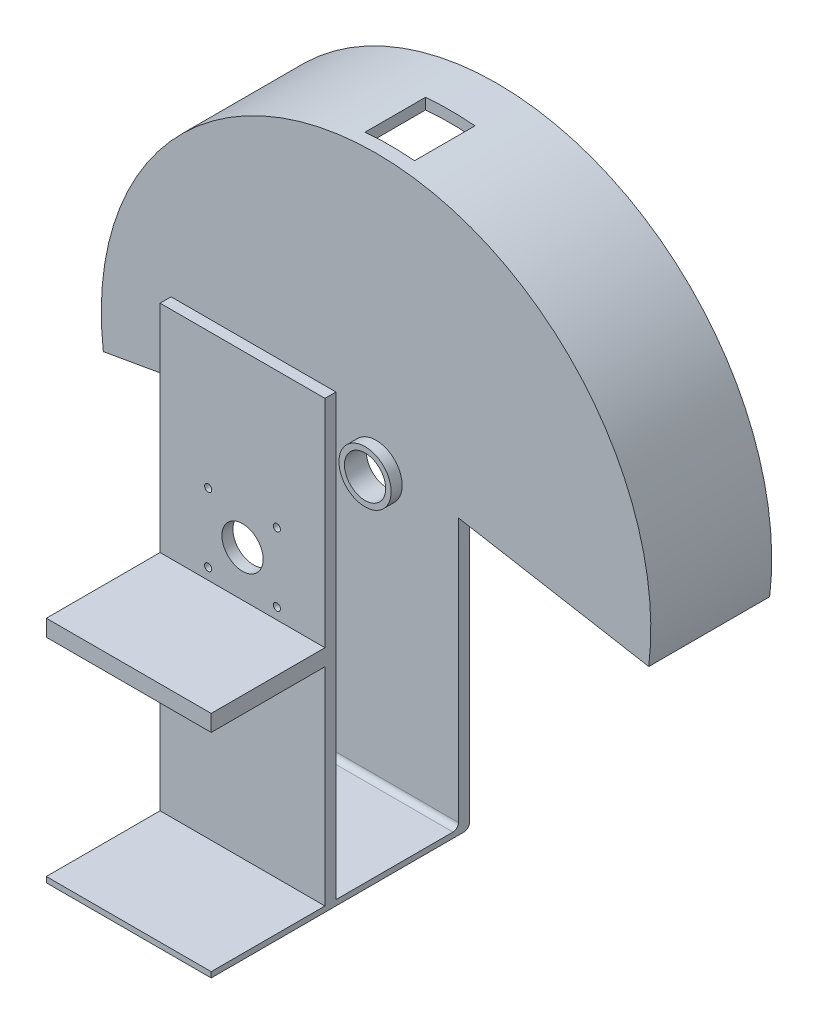
ISO-10303-21;
HEADER;
FILE_DESCRIPTION(('STEP AP214'),'2;1');
FILE_NAME('part.step','',(''),(''),'','','');
FILE_SCHEMA(('AUTOMOTIVE_DESIGN { 1 0 10303 214 1 1 1 1 }'));
ENDSEC;
DATA;
#1=APPLICATION_CONTEXT('core data for automotive mechanical design processes');
#2=APPLICATION_PROTOCOL_DEFINITION('international standard','automotive_design',2000,#1);
#3=PRODUCT_CONTEXT('',#1,'mechanical');
#4=PRODUCT('Part','Part','',(#3));
#5=PRODUCT_RELATED_PRODUCT_CATEGORY('part','',(#4));
#6=PRODUCT_DEFINITION_FORMATION('','',#4);
#7=PRODUCT_DEFINITION_CONTEXT('part definition',#1,'design');
#8=PRODUCT_DEFINITION('design','',#6,#7);
#9=PRODUCT_DEFINITION_SHAPE('','',#8);
#10=(LENGTH_UNIT() NAMED_UNIT(*) SI_UNIT(.MILLI.,.METRE.));
#11=(NAMED_UNIT(*) PLANE_ANGLE_UNIT() SI_UNIT($,.RADIAN.));
#12=(NAMED_UNIT(*) SI_UNIT($,.STERADIAN.) SOLID_ANGLE_UNIT());
#13=UNCERTAINTY_MEASURE_WITH_UNIT(LENGTH_MEASURE(1.E-05),#10,'distance_accuracy_value','');
#14=(GEOMETRIC_REPRESENTATION_CONTEXT(3) GLOBAL_UNCERTAINTY_ASSIGNED_CONTEXT((#13)) GLOBAL_UNIT_ASSIGNED_CONTEXT((#10,
#11,#12)) REPRESENTATION_CONTEXT('',''));
#15=CARTESIAN_POINT('',(0.,0.,0.));
#16=DIRECTION('',(0.,0.,1.));
#17=DIRECTION('',(1.,0.,0.));
#18=AXIS2_PLACEMENT_3D('',#15,#16,#17);
#19=CARTESIAN_POINT('',(0.,0.,5.08));
#20=DIRECTION('',(0.,0.,-1.));
#21=DIRECTION('',(-1.,0.,0.));
#22=AXIS2_PLACEMENT_3D('',#19,#20,#21);
#23=CYLINDRICAL_SURFACE('',#22,127.);
#24=DIRECTION('',(0.,0.,-1.));
#25=VECTOR('',#24,1.);
#26=CARTESIAN_POINT('',(126.049614627316,-15.5078900017081,5.08));
#27=LINE('',#26,#25);
#28=CARTESIAN_POINT('',(126.049614627316,-15.5078900017081,5.08));
#29=VERTEX_POINT('',#28);
#30=CARTESIAN_POINT('',(126.049614627316,-15.5078900017081,-50.8));
#31=VERTEX_POINT('',#30);
#32=EDGE_CURVE('E431',#29,#31,#27,.T.);
#33=ORIENTED_EDGE('',*,*,#32,.T.);
#34=CARTESIAN_POINT('',(0.,0.,-50.8));
#35=DIRECTION('',(0.,0.,-1.));
#36=DIRECTION('',(-1.,0.,0.));
#37=AXIS2_PLACEMENT_3D('',#34,#35,#36);
#38=CIRCLE('',#37,127.);
#39=CARTESIAN_POINT('',(-126.049614627316,-15.5078900017075,-50.8));
#40=VERTEX_POINT('',#39);
#41=EDGE_CURVE('E378',#40,#31,#38,.T.);
#42=ORIENTED_EDGE('',*,*,#41,.F.);
#43=DIRECTION('',(0.,0.,-1.));
#44=VECTOR('',#43,1.);
#45=CARTESIAN_POINT('',(-126.049614627316,-15.5078900017075,5.08));
#46=LINE('',#45,#44);
#47=CARTESIAN_POINT('',(-126.049614627316,-15.5078900017075,5.08));
#48=VERTEX_POINT('',#47);
#49=EDGE_CURVE('E416',#48,#40,#46,.T.);
#50=ORIENTED_EDGE('',*,*,#49,.F.);
#51=CARTESIAN_POINT('',(0.,0.,5.08));
#52=DIRECTION('',(0.,0.,1.));
#53=DIRECTION('',(-1.,0.,0.));
#54=AXIS2_PLACEMENT_3D('',#51,#52,#53);
#55=CIRCLE('',#54,127.);
#56=EDGE_CURVE('E413',#29,#48,#55,.T.);
#57=ORIENTED_EDGE('',*,*,#56,.F.);
#58=EDGE_LOOP('',(#33,#42,#50,#57));
#59=FACE_BOUND('',#58,.T.);
#60=CARTESIAN_POINT('',(0.,0.,-29.21));
#61=DIRECTION('',(0.,0.,1.));
#62=DIRECTION('',(1.,0.,0.));
#63=AXIS2_PLACEMENT_3D('',#60,#61,#62);
#64=CIRCLE('',#63,127.);
#65=CARTESIAN_POINT('',(11.43,126.48460420146,-29.21));
#66=VERTEX_POINT('',#65);
#67=CARTESIAN_POINT('',(-11.43,126.48460420146,-29.21));
#68=VERTEX_POINT('',#67);
#69=EDGE_CURVE('E201',#66,#68,#64,.T.);
#70=ORIENTED_EDGE('',*,*,#69,.F.);
#71=DIRECTION('',(0.,0.,-1.));
#72=VECTOR('',#71,1.);
#73=CARTESIAN_POINT('',(11.43,126.48460420146,5.08));
#74=LINE('',#73,#72);
#75=CARTESIAN_POINT('',(11.43,126.48460420146,-1.27));
#76=VERTEX_POINT('',#75);
#77=EDGE_CURVE('E209',#76,#66,#74,.T.);
#78=ORIENTED_EDGE('',*,*,#77,.F.);
#79=CARTESIAN_POINT('',(0.,0.,-1.27));
#80=DIRECTION('',(0.,0.,-1.));
#81=DIRECTION('',(-1.,0.,0.));
#82=AXIS2_PLACEMENT_3D('',#79,#80,#81);
#83=CIRCLE('',#82,127.);
#84=CARTESIAN_POINT('',(-11.43,126.48460420146,-1.27));
#85=VERTEX_POINT('',#84);
#86=EDGE_CURVE('E222',#85,#76,#83,.T.);
#87=ORIENTED_EDGE('',*,*,#86,.F.);
#88=DIRECTION('',(0.,0.,-1.));
#89=VECTOR('',#88,1.);
#90=CARTESIAN_POINT('',(-11.43,126.48460420146,5.08));
#91=LINE('',#90,#89);
#92=EDGE_CURVE('E215',#68,#85,#91,.F.);
#93=ORIENTED_EDGE('',*,*,#92,.F.);
#94=EDGE_LOOP('',(#70,#78,#87,#93));
#95=FACE_BOUND('',#94,.T.);
#96=ADVANCED_FACE('F41',(#59,#95),#23,.T.);
#97=CARTESIAN_POINT('',(0.,0.,-50.8));
#98=DIRECTION('',(0.,0.,1.));
#99=DIRECTION('',(1.,0.,0.));
#100=AXIS2_PLACEMENT_3D('',#97,#98,#99);
#101=CYLINDRICAL_SURFACE('',#100,121.92);
#102=CARTESIAN_POINT('',(0.,0.,0.));
#103=DIRECTION('',(0.,0.,-1.));
#104=DIRECTION('',(-1.,0.,0.));
#105=AXIS2_PLACEMENT_3D('',#102,#103,#104);
#106=CIRCLE('',#105,121.92);
#107=CARTESIAN_POINT('',(121.039704944136,-14.6245077536507,0.));
#108=VERTEX_POINT('',#107);
#109=CARTESIAN_POINT('',(-121.039704944136,-14.6245077536502,0.));
#110=VERTEX_POINT('',#109);
#111=EDGE_CURVE('E352',#108,#110,#106,.F.);
#112=ORIENTED_EDGE('',*,*,#111,.T.);
#113=DIRECTION('',(0.,0.,1.));
#114=VECTOR('',#113,1.);
#115=CARTESIAN_POINT('',(-121.039704944136,-14.6245077536502,-50.8));
#116=LINE('',#115,#114);
#117=CARTESIAN_POINT('',(-121.039704944136,-14.6245077536502,-50.8));
#118=VERTEX_POINT('',#117);
#119=EDGE_CURVE('E382',#118,#110,#116,.T.);
#120=ORIENTED_EDGE('',*,*,#119,.F.);
#121=CARTESIAN_POINT('',(0.,0.,-50.8));
#122=DIRECTION('',(0.,0.,-1.));
#123=DIRECTION('',(-1.,0.,0.));
#124=AXIS2_PLACEMENT_3D('',#121,#122,#123);
#125=CIRCLE('',#124,121.92);
#126=CARTESIAN_POINT('',(121.039704944136,-14.6245077536507,-50.8));
#127=VERTEX_POINT('',#126);
#128=EDGE_CURVE('E371',#127,#118,#125,.F.);
#129=ORIENTED_EDGE('',*,*,#128,.F.);
#130=DIRECTION('',(0.,0.,1.));
#131=VECTOR('',#130,1.);
#132=CARTESIAN_POINT('',(121.039704944136,-14.6245077536507,-50.8));
#133=LINE('',#132,#131);
#134=EDGE_CURVE('E389',#127,#108,#133,.T.);
#135=ORIENTED_EDGE('',*,*,#134,.T.);
#136=EDGE_LOOP('',(#112,#120,#129,#135));
#137=FACE_BOUND('',#136,.T.);
#138=DIRECTION('',(0.,0.,1.));
#139=VECTOR('',#138,1.);
#140=CARTESIAN_POINT('',(-11.43,121.383036294204,-50.8));
#141=LINE('',#140,#139);
#142=CARTESIAN_POINT('',(-11.43,121.383036294204,-1.27));
#143=VERTEX_POINT('',#142);
#144=CARTESIAN_POINT('',(-11.43,121.383036294204,-29.21));
#145=VERTEX_POINT('',#144);
#146=EDGE_CURVE('E11',#143,#145,#141,.F.);
#147=ORIENTED_EDGE('',*,*,#146,.F.);
#148=CARTESIAN_POINT('',(0.,0.,-1.27));
#149=DIRECTION('',(0.,0.,-1.));
#150=DIRECTION('',(-1.,0.,0.));
#151=AXIS2_PLACEMENT_3D('',#148,#149,#150);
#152=CIRCLE('',#151,121.92);
#153=CARTESIAN_POINT('',(11.43,121.383036294204,-1.27));
#154=VERTEX_POINT('',#153);
#155=EDGE_CURVE('E50',#154,#143,#152,.F.);
#156=ORIENTED_EDGE('',*,*,#155,.F.);
#157=DIRECTION('',(0.,0.,1.));
#158=VECTOR('',#157,1.);
#159=CARTESIAN_POINT('',(11.43,121.383036294204,-50.8));
#160=LINE('',#159,#158);
#161=CARTESIAN_POINT('',(11.43,121.383036294204,-29.21));
#162=VERTEX_POINT('',#161);
#163=EDGE_CURVE('E489',#162,#154,#160,.T.);
#164=ORIENTED_EDGE('',*,*,#163,.F.);
#165=CARTESIAN_POINT('',(0.,0.,-29.21));
#166=DIRECTION('',(0.,0.,1.));
#167=DIRECTION('',(1.,0.,0.));
#168=AXIS2_PLACEMENT_3D('',#165,#166,#167);
#169=CIRCLE('',#168,121.92);
#170=EDGE_CURVE('E486',#145,#162,#169,.F.);
#171=ORIENTED_EDGE('',*,*,#170,.F.);
#172=EDGE_LOOP('',(#147,#156,#164,#171));
#173=FACE_BOUND('',#172,.T.);
#174=ADVANCED_FACE('F502',(#137,#173),#101,.F.);
#175=CARTESIAN_POINT('',(-241.363490081224,-124.46,66.802));
#176=DIRECTION('',(0.,0.,1.));
#177=DIRECTION('',(1.,0.,0.));
#178=AXIS2_PLACEMENT_3D('',#175,#176,#177);
#179=PLANE('',#178);
#180=CARTESIAN_POINT('',(15.875,15.875,66.802));
#181=DIRECTION('',(0.,0.,1.));
#182=DIRECTION('',(1.,0.,0.));
#183=AXIS2_PLACEMENT_3D('',#180,#181,#182);
#184=CIRCLE('',#183,1.65099999999999);
#185=CARTESIAN_POINT('',(17.526,15.875,66.802));
#186=VERTEX_POINT('',#185);
#187=EDGE_CURVE('E243',#186,#186,#184,.T.);
#188=ORIENTED_EDGE('',*,*,#187,.F.);
#189=EDGE_LOOP('',(#188));
#190=FACE_BOUND('',#189,.T.);
#191=CARTESIAN_POINT('',(-15.875,-15.875,66.802));
#192=DIRECTION('',(0.,0.,1.));
#193=DIRECTION('',(1.,0.,0.));
#194=AXIS2_PLACEMENT_3D('',#191,#192,#193);
#195=CIRCLE('',#194,1.65099999999999);
#196=CARTESIAN_POINT('',(-14.224,-15.875,66.802));
#197=VERTEX_POINT('',#196);
#198=EDGE_CURVE('E236',#197,#197,#195,.T.);
#199=ORIENTED_EDGE('',*,*,#198,.F.);
#200=EDGE_LOOP('',(#199));
#201=FACE_BOUND('',#200,.T.);
#202=CARTESIAN_POINT('',(15.875,-15.875,66.802));
#203=DIRECTION('',(0.,0.,1.));
#204=DIRECTION('',(1.,0.,0.));
#205=AXIS2_PLACEMENT_3D('',#202,#203,#204);
#206=CIRCLE('',#205,1.65099999999999);
#207=CARTESIAN_POINT('',(17.526,-15.875,66.802));
#208=VERTEX_POINT('',#207);
#209=EDGE_CURVE('E224',#208,#208,#206,.T.);
#210=ORIENTED_EDGE('',*,*,#209,.F.);
#211=EDGE_LOOP('',(#210));
#212=FACE_BOUND('',#211,.T.);
#213=CARTESIAN_POINT('',(-15.875,15.875,66.802));
#214=DIRECTION('',(0.,0.,1.));
#215=DIRECTION('',(1.,0.,0.));
#216=AXIS2_PLACEMENT_3D('',#213,#214,#215);
#217=CIRCLE('',#216,1.65099999999999);
#218=CARTESIAN_POINT('',(-14.224,15.875,66.802));
#219=VERTEX_POINT('',#218);
#220=EDGE_CURVE('E242',#219,#219,#217,.T.);
#221=ORIENTED_EDGE('',*,*,#220,.F.);
#222=EDGE_LOOP('',(#221));
#223=FACE_BOUND('',#222,.T.);
#224=DIRECTION('',(-1.,0.,0.));
#225=VECTOR('',#224,1.);
#226=CARTESIAN_POINT('',(-241.363490081224,-21.082,66.802));
#227=LINE('',#226,#225);
#228=CARTESIAN_POINT('',(38.1,-21.082,66.802));
#229=VERTEX_POINT('',#228);
#230=CARTESIAN_POINT('',(-38.1,-21.082,66.802));
#231=VERTEX_POINT('',#230);
#232=EDGE_CURVE('E483',#229,#231,#227,.T.);
#233=ORIENTED_EDGE('',*,*,#232,.F.);
#234=DIRECTION('',(0.,-1.,0.));
#235=VECTOR('',#234,1.);
#236=CARTESIAN_POINT('',(38.1,-124.46,66.802));
#237=LINE('',#236,#235);
#238=CARTESIAN_POINT('',(38.1,78.74,66.802));
#239=VERTEX_POINT('',#238);
#240=EDGE_CURVE('E312',#239,#229,#237,.T.);
#241=ORIENTED_EDGE('',*,*,#240,.F.);
#242=DIRECTION('',(1.,0.,0.));
#243=VECTOR('',#242,1.);
#244=CARTESIAN_POINT('',(-241.363490081224,78.74,66.802));
#245=LINE('',#244,#243);
#246=CARTESIAN_POINT('',(-38.1,78.74,66.802));
#247=VERTEX_POINT('',#246);
#248=EDGE_CURVE('E325',#247,#239,#245,.T.);
#249=ORIENTED_EDGE('',*,*,#248,.F.);
#250=DIRECTION('',(0.,1.,0.));
#251=VECTOR('',#250,1.);
#252=CARTESIAN_POINT('',(-38.1,-124.46,66.802));
#253=LINE('',#252,#251);
#254=EDGE_CURVE('E301',#231,#247,#253,.T.);
#255=ORIENTED_EDGE('',*,*,#254,.F.);
#256=EDGE_LOOP('',(#233,#241,#249,#255));
#257=FACE_BOUND('',#256,.T.);
#258=CARTESIAN_POINT('',(0.,0.,66.802));
#259=DIRECTION('',(0.,0.,1.));
#260=DIRECTION('',(1.,0.,0.));
#261=AXIS2_PLACEMENT_3D('',#258,#259,#260);
#262=CIRCLE('',#261,9.525);
#263=CARTESIAN_POINT('',(-9.525,0.,66.802));
#264=VERTEX_POINT('',#263);
#265=EDGE_CURVE('E287',#264,#264,#262,.F.);
#266=ORIENTED_EDGE('',*,*,#265,.T.);
#267=EDGE_LOOP('',(#266));
#268=FACE_BOUND('',#267,.T.);
#269=ADVANCED_FACE('F524',(#190,#201,#212,#223,#257,#268),#179,.T.);
#270=CARTESIAN_POINT('',(152.428218738857,-124.46,5.08));
#271=DIRECTION('',(0.,1.,0.));
#272=DIRECTION('',(-1.,0.,0.));
#273=AXIS2_PLACEMENT_3D('',#270,#271,#272);
#274=PLANE('',#273);
#275=DIRECTION('',(1.,0.,0.));
#276=VECTOR('',#275,1.);
#277=CARTESIAN_POINT('',(-241.363490081224,-124.46,61.722));
#278=LINE('',#277,#276);
#279=CARTESIAN_POINT('',(-38.1,-124.46,61.722));
#280=VERTEX_POINT('',#279);
#281=CARTESIAN_POINT('',(38.1,-124.46,61.722));
#282=VERTEX_POINT('',#281);
#283=EDGE_CURVE('E317',#280,#282,#278,.T.);
#284=ORIENTED_EDGE('',*,*,#283,.T.);
#285=DIRECTION('',(0.,0.,1.));
#286=VECTOR('',#285,1.);
#287=CARTESIAN_POINT('',(38.1,-124.46,5.08));
#288=LINE('',#287,#286);
#289=CARTESIAN_POINT('',(38.1,-124.46,7.62));
#290=VERTEX_POINT('',#289);
#291=EDGE_CURVE('E348',#290,#282,#288,.T.);
#292=ORIENTED_EDGE('',*,*,#291,.F.);
#293=DIRECTION('',(-1.,0.,0.));
#294=VECTOR('',#293,1.);
#295=CARTESIAN_POINT('',(152.428218738857,-124.46,7.62));
#296=LINE('',#295,#294);
#297=CARTESIAN_POINT('',(-38.1,-124.46,7.62));
#298=VERTEX_POINT('',#297);
#299=EDGE_CURVE('E463',#290,#298,#296,.T.);
#300=ORIENTED_EDGE('',*,*,#299,.T.);
#301=DIRECTION('',(0.,0.,-1.));
#302=VECTOR('',#301,1.);
#303=CARTESIAN_POINT('',(-38.1,-124.46,5.08));
#304=LINE('',#303,#302);
#305=EDGE_CURVE('E356',#280,#298,#304,.T.);
#306=ORIENTED_EDGE('',*,*,#305,.F.);
#307=EDGE_LOOP('',(#284,#292,#300,#306));
#308=FACE_BOUND('',#307,.T.);
#309=ADVANCED_FACE('F610',(#308),#274,.T.);
#310=CARTESIAN_POINT('',(0.,0.,5.08));
#311=DIRECTION('',(0.,0.,-1.));
#312=DIRECTION('',(-1.,0.,0.));
#313=AXIS2_PLACEMENT_3D('',#310,#311,#312);
#314=PLANE('',#313);
#315=DIRECTION('',(0.,-1.,0.));
#316=VECTOR('',#315,1.);
#317=CARTESIAN_POINT('',(-38.1,0.,5.08));
#318=LINE('',#317,#316);
#319=CARTESIAN_POINT('',(-38.1,0.,5.08));
#320=VERTEX_POINT('',#319);
#321=CARTESIAN_POINT('',(-38.1,-121.92,5.08));
#322=VERTEX_POINT('',#321);
#323=EDGE_CURVE('E402',#320,#322,#318,.T.);
#324=ORIENTED_EDGE('',*,*,#323,.T.);
#325=DIRECTION('',(-1.,0.,0.));
#326=VECTOR('',#325,1.);
#327=CARTESIAN_POINT('',(0.,-121.92,5.08));
#328=LINE('',#327,#326);
#329=CARTESIAN_POINT('',(38.1,-121.92,5.08));
#330=VERTEX_POINT('',#329);
#331=EDGE_CURVE('E467',#322,#330,#328,.F.);
#332=ORIENTED_EDGE('',*,*,#331,.T.);
#333=DIRECTION('',(0.,1.,0.));
#334=VECTOR('',#333,1.);
#335=CARTESIAN_POINT('',(38.1,0.,5.08));
#336=LINE('',#335,#334);
#337=CARTESIAN_POINT('',(38.1,0.,5.08));
#338=VERTEX_POINT('',#337);
#339=EDGE_CURVE('E407',#330,#338,#336,.T.);
#340=ORIENTED_EDGE('',*,*,#339,.T.);
#341=DIRECTION('',(0.984807753012207,-0.173648177666934,0.));
#342=VECTOR('',#341,1.);
#343=CARTESIAN_POINT('',(38.1,0.,5.08));
#344=LINE('',#343,#342);
#345=EDGE_CURVE('E410',#338,#29,#344,.T.);
#346=ORIENTED_EDGE('',*,*,#345,.T.);
#347=ORIENTED_EDGE('',*,*,#56,.T.);
#348=DIRECTION('',(0.984807753012209,0.173648177666928,0.));
#349=VECTOR('',#348,1.);
#350=CARTESIAN_POINT('',(-38.1,0.,5.08));
#351=LINE('',#350,#349);
#352=EDGE_CURVE('E398',#48,#320,#351,.T.);
#353=ORIENTED_EDGE('',*,*,#352,.T.);
#354=EDGE_LOOP('',(#324,#332,#340,#346,#347,#353));
#355=FACE_BOUND('',#354,.T.);
#356=CARTESIAN_POINT('',(0.,0.,5.08));
#357=DIRECTION('',(0.,0.,-1.));
#358=DIRECTION('',(-1.,0.,0.));
#359=AXIS2_PLACEMENT_3D('',#356,#357,#358);
#360=CIRCLE('',#359,12.065);
#361=CARTESIAN_POINT('',(-12.065,0.,5.08));
#362=VERTEX_POINT('',#361);
#363=EDGE_CURVE('E476',#362,#362,#360,.F.);
#364=ORIENTED_EDGE('',*,*,#363,.F.);
#365=EDGE_LOOP('',(#364));
#366=FACE_BOUND('',#365,.T.);
#367=ADVANCED_FACE('F615',(#355,#366),#314,.F.);
#368=CARTESIAN_POINT('',(0.,0.,0.));
#369=DIRECTION('',(0.,0.,-1.));
#370=DIRECTION('',(-1.,0.,0.));
#371=AXIS2_PLACEMENT_3D('',#368,#369,#370);
#372=PLANE('',#371);
#373=CARTESIAN_POINT('',(0.,0.,0.));
#374=DIRECTION('',(0.,0.,1.));
#375=DIRECTION('',(1.,0.,0.));
#376=AXIS2_PLACEMENT_3D('',#373,#374,#375);
#377=CIRCLE('',#376,9.525);
#378=CARTESIAN_POINT('',(9.525,0.,0.));
#379=VERTEX_POINT('',#378);
#380=EDGE_CURVE('E393',#379,#379,#377,.T.);
#381=ORIENTED_EDGE('',*,*,#380,.T.);
#382=EDGE_LOOP('',(#381));
#383=FACE_BOUND('',#382,.T.);
#384=DIRECTION('',(0.,1.,0.));
#385=VECTOR('',#384,1.);
#386=CARTESIAN_POINT('',(38.1,0.,0.));
#387=LINE('',#386,#385);
#388=CARTESIAN_POINT('',(38.1,-124.46,0.));
#389=VERTEX_POINT('',#388);
#390=CARTESIAN_POINT('',(38.1,0.,0.));
#391=VERTEX_POINT('',#390);
#392=EDGE_CURVE('E423',#389,#391,#387,.T.);
#393=ORIENTED_EDGE('',*,*,#392,.F.);
#394=DIRECTION('',(1.,0.,0.));
#395=VECTOR('',#394,1.);
#396=CARTESIAN_POINT('',(-38.1,-124.46,0.));
#397=LINE('',#396,#395);
#398=CARTESIAN_POINT('',(-38.1,-124.46,0.));
#399=VERTEX_POINT('',#398);
#400=EDGE_CURVE('E457',#389,#399,#397,.F.);
#401=ORIENTED_EDGE('',*,*,#400,.T.);
#402=DIRECTION('',(0.,-1.,0.));
#403=VECTOR('',#402,1.);
#404=CARTESIAN_POINT('',(-38.1,0.,0.));
#405=LINE('',#404,#403);
#406=CARTESIAN_POINT('',(-38.1,0.,0.));
#407=VERTEX_POINT('',#406);
#408=EDGE_CURVE('E419',#407,#399,#405,.T.);
#409=ORIENTED_EDGE('',*,*,#408,.F.);
#410=DIRECTION('',(0.984807753012209,0.173648177666928,0.));
#411=VECTOR('',#410,1.);
#412=CARTESIAN_POINT('',(-38.1,0.,0.));
#413=LINE('',#412,#411);
#414=EDGE_CURVE('E397',#110,#407,#413,.T.);
#415=ORIENTED_EDGE('',*,*,#414,.F.);
#416=ORIENTED_EDGE('',*,*,#111,.F.);
#417=DIRECTION('',(0.984807753012207,-0.173648177666934,0.));
#418=VECTOR('',#417,1.);
#419=CARTESIAN_POINT('',(38.1,0.,0.));
#420=LINE('',#419,#418);
#421=EDGE_CURVE('E403',#391,#108,#420,.T.);
#422=ORIENTED_EDGE('',*,*,#421,.F.);
#423=EDGE_LOOP('',(#393,#401,#409,#415,#416,#422));
#424=FACE_BOUND('',#423,.T.);
#425=ADVANCED_FACE('F529',(#383,#424),#372,.T.);
#426=CARTESIAN_POINT('',(-38.1,0.,5.08));
#427=DIRECTION('',(-0.173648177666928,0.984807753012208,0.));
#428=DIRECTION('',(-0.984807753012209,-0.173648177666928,0.));
#429=AXIS2_PLACEMENT_3D('',#426,#427,#428);
#430=PLANE('',#429);
#431=ORIENTED_EDGE('',*,*,#49,.T.);
#432=DIRECTION('',(-0.984807753012209,-0.173648177666928,0.));
#433=VECTOR('',#432,1.);
#434=CARTESIAN_POINT('',(-1.14885557402841,6.51548373035387,-50.8));
#435=LINE('',#434,#433);
#436=EDGE_CURVE('E374',#118,#40,#435,.T.);
#437=ORIENTED_EDGE('',*,*,#436,.F.);
#438=ORIENTED_EDGE('',*,*,#119,.T.);
#439=ORIENTED_EDGE('',*,*,#414,.T.);
#440=DIRECTION('',(0.,0.,-1.));
#441=VECTOR('',#440,1.);
#442=CARTESIAN_POINT('',(-38.1,0.,5.08));
#443=LINE('',#442,#441);
#444=EDGE_CURVE('E446',#320,#407,#443,.T.);
#445=ORIENTED_EDGE('',*,*,#444,.F.);
#446=ORIENTED_EDGE('',*,*,#352,.F.);
#447=EDGE_LOOP('',(#431,#437,#438,#439,#445,#446));
#448=FACE_BOUND('',#447,.T.);
#449=ADVANCED_FACE('F546',(#448),#430,.F.);
#450=CARTESIAN_POINT('',(-38.1,0.,5.08));
#451=DIRECTION('',(1.,0.,0.));
#452=DIRECTION('',(0.,1.,0.));
#453=AXIS2_PLACEMENT_3D('',#450,#451,#452);
#454=PLANE('',#453);
#455=CARTESIAN_POINT('',(-38.1,-124.46,66.802));
#456=VERTEX_POINT('',#455);
#457=CARTESIAN_POINT('',(-38.1,-28.702,66.802));
#458=VERTEX_POINT('',#457);
#459=EDGE_CURVE('E296',#456,#458,#253,.T.);
#460=ORIENTED_EDGE('',*,*,#459,.T.);
#461=DIRECTION('',(0.,0.,1.));
#462=VECTOR('',#461,1.);
#463=CARTESIAN_POINT('',(-38.1,-28.702,61.722));
#464=LINE('',#463,#462);
#465=CARTESIAN_POINT('',(-38.1,-28.702,119.38));
#466=VERTEX_POINT('',#465);
#467=EDGE_CURVE('E258',#458,#466,#464,.T.);
#468=ORIENTED_EDGE('',*,*,#467,.T.);
#469=DIRECTION('',(0.,1.,0.));
#470=VECTOR('',#469,1.);
#471=CARTESIAN_POINT('',(-38.1,-21.082,119.38));
#472=LINE('',#471,#470);
#473=CARTESIAN_POINT('',(-38.1,-21.082,119.38));
#474=VERTEX_POINT('',#473);
#475=EDGE_CURVE('E271',#466,#474,#472,.T.);
#476=ORIENTED_EDGE('',*,*,#475,.T.);
#477=DIRECTION('',(0.,0.,-1.));
#478=VECTOR('',#477,1.);
#479=CARTESIAN_POINT('',(-38.1,-21.082,61.722));
#480=LINE('',#479,#478);
#481=EDGE_CURVE('E275',#474,#231,#480,.T.);
#482=ORIENTED_EDGE('',*,*,#481,.T.);
#483=ORIENTED_EDGE('',*,*,#254,.T.);
#484=DIRECTION('',(0.,0.,-1.));
#485=VECTOR('',#484,1.);
#486=CARTESIAN_POINT('',(-38.1,78.74,61.722));
#487=LINE('',#486,#485);
#488=CARTESIAN_POINT('',(-38.1,78.74,61.722));
#489=VERTEX_POINT('',#488);
#490=EDGE_CURVE('E304',#247,#489,#487,.T.);
#491=ORIENTED_EDGE('',*,*,#490,.T.);
#492=DIRECTION('',(0.,-1.,0.));
#493=VECTOR('',#492,1.);
#494=CARTESIAN_POINT('',(-38.1,-124.46,61.722));
#495=LINE('',#494,#493);
#496=EDGE_CURVE('E300',#489,#280,#495,.T.);
#497=ORIENTED_EDGE('',*,*,#496,.T.);
#498=ORIENTED_EDGE('',*,*,#305,.T.);
#499=CARTESIAN_POINT('',(-38.1,-121.92,7.62));
#500=DIRECTION('',(1.,0.,0.));
#501=DIRECTION('',(0.,1.,0.));
#502=AXIS2_PLACEMENT_3D('',#499,#500,#501);
#503=CIRCLE('',#502,2.54);
#504=EDGE_CURVE('E470',#298,#322,#503,.T.);
#505=ORIENTED_EDGE('',*,*,#504,.T.);
#506=ORIENTED_EDGE('',*,*,#323,.F.);
#507=ORIENTED_EDGE('',*,*,#444,.T.);
#508=ORIENTED_EDGE('',*,*,#408,.T.);
#509=CARTESIAN_POINT('',(-38.1,-124.46,2.54));
#510=DIRECTION('',(1.,0.,0.));
#511=DIRECTION('',(0.,1.,0.));
#512=AXIS2_PLACEMENT_3D('',#509,#510,#511);
#513=CIRCLE('',#512,2.54);
#514=CARTESIAN_POINT('',(-38.1,-127.,2.54));
#515=VERTEX_POINT('',#514);
#516=EDGE_CURVE('E460',#399,#515,#513,.F.);
#517=ORIENTED_EDGE('',*,*,#516,.T.);
#518=DIRECTION('',(0.,0.,-1.));
#519=VECTOR('',#518,1.);
#520=CARTESIAN_POINT('',(-38.1,-127.,5.08));
#521=LINE('',#520,#519);
#522=CARTESIAN_POINT('',(-38.1,-127.,119.38));
#523=VERTEX_POINT('',#522);
#524=EDGE_CURVE('E442',#523,#515,#521,.T.);
#525=ORIENTED_EDGE('',*,*,#524,.F.);
#526=DIRECTION('',(0.,1.,0.));
#527=VECTOR('',#526,1.);
#528=CARTESIAN_POINT('',(-38.1,-127.,119.38));
#529=LINE('',#528,#527);
#530=CARTESIAN_POINT('',(-38.1,-124.46,119.38));
#531=VERTEX_POINT('',#530);
#532=EDGE_CURVE('E341',#523,#531,#529,.T.);
#533=ORIENTED_EDGE('',*,*,#532,.T.);
#534=EDGE_CURVE('E357',#531,#456,#304,.T.);
#535=ORIENTED_EDGE('',*,*,#534,.T.);
#536=EDGE_LOOP('',(#460,#468,#476,#482,#483,#491,#497,#498,#505,#506,#507,#508,#517,#525,#533,#535));
#537=FACE_BOUND('',#536,.T.);
#538=ADVANCED_FACE('F542',(#537),#454,.F.);
#539=CARTESIAN_POINT('',(-38.1,-127.,5.08));
#540=DIRECTION('',(0.,1.,0.));
#541=DIRECTION('',(0.,0.,1.));
#542=AXIS2_PLACEMENT_3D('',#539,#540,#541);
#543=PLANE('',#542);
#544=ORIENTED_EDGE('',*,*,#524,.T.);
#545=DIRECTION('',(1.,0.,0.));
#546=VECTOR('',#545,1.);
#547=CARTESIAN_POINT('',(38.1,-127.,2.54));
#548=LINE('',#547,#546);
#549=CARTESIAN_POINT('',(38.1,-127.,2.54));
#550=VERTEX_POINT('',#549);
#551=EDGE_CURVE('E450',#515,#550,#548,.T.);
#552=ORIENTED_EDGE('',*,*,#551,.T.);
#553=DIRECTION('',(0.,0.,-1.));
#554=VECTOR('',#553,1.);
#555=CARTESIAN_POINT('',(38.1,-127.,5.08));
#556=LINE('',#555,#554);
#557=CARTESIAN_POINT('',(38.1,-127.,119.38));
#558=VERTEX_POINT('',#557);
#559=EDGE_CURVE('E438',#558,#550,#556,.T.);
#560=ORIENTED_EDGE('',*,*,#559,.F.);
#561=DIRECTION('',(-1.,0.,0.));
#562=VECTOR('',#561,1.);
#563=CARTESIAN_POINT('',(152.428218738857,-127.,119.38));
#564=LINE('',#563,#562);
#565=EDGE_CURVE('E361',#558,#523,#564,.T.);
#566=ORIENTED_EDGE('',*,*,#565,.T.);
#567=EDGE_LOOP('',(#544,#552,#560,#566));
#568=FACE_BOUND('',#567,.T.);
#569=ADVANCED_FACE('F539',(#568),#543,.F.);
#570=CARTESIAN_POINT('',(38.1,0.,5.08));
#571=DIRECTION('',(-1.,0.,0.));
#572=DIRECTION('',(0.,-1.,0.));
#573=AXIS2_PLACEMENT_3D('',#570,#571,#572);
#574=PLANE('',#573);
#575=DIRECTION('',(0.,1.,0.));
#576=VECTOR('',#575,1.);
#577=CARTESIAN_POINT('',(38.1,-124.46,61.722));
#578=LINE('',#577,#576);
#579=CARTESIAN_POINT('',(38.1,78.74,61.722));
#580=VERTEX_POINT('',#579);
#581=EDGE_CURVE('E292',#282,#580,#578,.T.);
#582=ORIENTED_EDGE('',*,*,#581,.T.);
#583=DIRECTION('',(0.,0.,1.));
#584=VECTOR('',#583,1.);
#585=CARTESIAN_POINT('',(38.1,78.74,61.722));
#586=LINE('',#585,#584);
#587=EDGE_CURVE('E307',#580,#239,#586,.T.);
#588=ORIENTED_EDGE('',*,*,#587,.T.);
#589=ORIENTED_EDGE('',*,*,#240,.T.);
#590=DIRECTION('',(0.,0.,1.));
#591=VECTOR('',#590,1.);
#592=CARTESIAN_POINT('',(38.1,-21.082,61.722));
#593=LINE('',#592,#591);
#594=CARTESIAN_POINT('',(38.1,-21.082,119.38));
#595=VERTEX_POINT('',#594);
#596=EDGE_CURVE('E265',#229,#595,#593,.T.);
#597=ORIENTED_EDGE('',*,*,#596,.T.);
#598=DIRECTION('',(0.,-1.,0.));
#599=VECTOR('',#598,1.);
#600=CARTESIAN_POINT('',(38.1,-21.082,119.38));
#601=LINE('',#600,#599);
#602=CARTESIAN_POINT('',(38.1,-28.702,119.38));
#603=VERTEX_POINT('',#602);
#604=EDGE_CURVE('E262',#595,#603,#601,.T.);
#605=ORIENTED_EDGE('',*,*,#604,.T.);
#606=DIRECTION('',(0.,0.,-1.));
#607=VECTOR('',#606,1.);
#608=CARTESIAN_POINT('',(38.1,-28.702,61.722));
#609=LINE('',#608,#607);
#610=CARTESIAN_POINT('',(38.1,-28.702,66.802));
#611=VERTEX_POINT('',#610);
#612=EDGE_CURVE('E64',#603,#611,#609,.T.);
#613=ORIENTED_EDGE('',*,*,#612,.T.);
#614=CARTESIAN_POINT('',(38.1,-124.46,66.802));
#615=VERTEX_POINT('',#614);
#616=EDGE_CURVE('E311',#611,#615,#237,.T.);
#617=ORIENTED_EDGE('',*,*,#616,.T.);
#618=CARTESIAN_POINT('',(38.1,-124.46,119.38));
#619=VERTEX_POINT('',#618);
#620=EDGE_CURVE('E346',#615,#619,#288,.T.);
#621=ORIENTED_EDGE('',*,*,#620,.T.);
#622=DIRECTION('',(0.,-1.,0.));
#623=VECTOR('',#622,1.);
#624=CARTESIAN_POINT('',(38.1,-127.,119.38));
#625=LINE('',#624,#623);
#626=EDGE_CURVE('E342',#619,#558,#625,.T.);
#627=ORIENTED_EDGE('',*,*,#626,.T.);
#628=ORIENTED_EDGE('',*,*,#559,.T.);
#629=CARTESIAN_POINT('',(38.1,-124.46,2.54));
#630=DIRECTION('',(-1.,0.,0.));
#631=DIRECTION('',(0.,-1.,0.));
#632=AXIS2_PLACEMENT_3D('',#629,#630,#631);
#633=CIRCLE('',#632,2.54);
#634=EDGE_CURVE('E454',#550,#389,#633,.F.);
#635=ORIENTED_EDGE('',*,*,#634,.T.);
#636=ORIENTED_EDGE('',*,*,#392,.T.);
#637=DIRECTION('',(0.,0.,-1.));
#638=VECTOR('',#637,1.);
#639=CARTESIAN_POINT('',(38.1,0.,5.08));
#640=LINE('',#639,#638);
#641=EDGE_CURVE('E434',#338,#391,#640,.T.);
#642=ORIENTED_EDGE('',*,*,#641,.F.);
#643=ORIENTED_EDGE('',*,*,#339,.F.);
#644=CARTESIAN_POINT('',(38.1,-121.92,7.62));
#645=DIRECTION('',(-1.,0.,0.));
#646=DIRECTION('',(0.,-1.,0.));
#647=AXIS2_PLACEMENT_3D('',#644,#645,#646);
#648=CIRCLE('',#647,2.54);
#649=EDGE_CURVE('E473',#330,#290,#648,.T.);
#650=ORIENTED_EDGE('',*,*,#649,.T.);
#651=ORIENTED_EDGE('',*,*,#291,.T.);
#652=EDGE_LOOP('',(#582,#588,#589,#597,#605,#613,#617,#621,#627,#628,#635,#636,#642,#643,#650,#651));
#653=FACE_BOUND('',#652,.T.);
#654=ADVANCED_FACE('F535',(#653),#574,.F.);
#655=CARTESIAN_POINT('',(38.1,0.,5.08));
#656=DIRECTION('',(0.173648177666934,0.984807753012207,0.));
#657=DIRECTION('',(-0.984807753012207,0.173648177666934,0.));
#658=AXIS2_PLACEMENT_3D('',#655,#656,#657);
#659=PLANE('',#658);
#660=ORIENTED_EDGE('',*,*,#421,.T.);
#661=ORIENTED_EDGE('',*,*,#134,.F.);
#662=DIRECTION('',(-0.984807753012208,0.173648177666934,0.));
#663=VECTOR('',#662,1.);
#664=CARTESIAN_POINT('',(1.14885557402849,6.51548373035411,-50.8));
#665=LINE('',#664,#663);
#666=EDGE_CURVE('E367',#31,#127,#665,.T.);
#667=ORIENTED_EDGE('',*,*,#666,.F.);
#668=ORIENTED_EDGE('',*,*,#32,.F.);
#669=ORIENTED_EDGE('',*,*,#345,.F.);
#670=ORIENTED_EDGE('',*,*,#641,.T.);
#671=EDGE_LOOP('',(#660,#661,#667,#668,#669,#670));
#672=FACE_BOUND('',#671,.T.);
#673=ADVANCED_FACE('F531',(#672),#659,.F.);
#674=CARTESIAN_POINT('',(0.,0.,5.08));
#675=DIRECTION('',(0.,0.,-1.));
#676=DIRECTION('',(-1.,0.,0.));
#677=AXIS2_PLACEMENT_3D('',#674,#675,#676);
#678=CYLINDRICAL_SURFACE('',#677,9.525);
#679=ORIENTED_EDGE('',*,*,#380,.F.);
#680=EDGE_LOOP('',(#679));
#681=FACE_BOUND('',#680,.T.);
#682=CARTESIAN_POINT('',(0.,0.,10.16));
#683=DIRECTION('',(0.,0.,1.));
#684=DIRECTION('',(1.,0.,0.));
#685=AXIS2_PLACEMENT_3D('',#682,#683,#684);
#686=CIRCLE('',#685,9.525);
#687=CARTESIAN_POINT('',(9.525,0.,10.16));
#688=VERTEX_POINT('',#687);
#689=EDGE_CURVE('E333',#688,#688,#686,.T.);
#690=ORIENTED_EDGE('',*,*,#689,.T.);
#691=EDGE_LOOP('',(#690));
#692=FACE_BOUND('',#691,.T.);
#693=ADVANCED_FACE('F534',(#681,#692),#678,.F.);
#694=CARTESIAN_POINT('',(0.,0.,-50.8));
#695=DIRECTION('',(0.,0.,-1.));
#696=DIRECTION('',(-1.,0.,0.));
#697=AXIS2_PLACEMENT_3D('',#694,#695,#696);
#698=PLANE('',#697);
#699=ORIENTED_EDGE('',*,*,#666,.T.);
#700=ORIENTED_EDGE('',*,*,#128,.T.);
#701=ORIENTED_EDGE('',*,*,#436,.T.);
#702=ORIENTED_EDGE('',*,*,#41,.T.);
#703=EDGE_LOOP('',(#699,#700,#701,#702));
#704=FACE_BOUND('',#703,.T.);
#705=ADVANCED_FACE('F631',(#704),#698,.T.);
#706=DIRECTION('',(1.,0.,0.));
#707=VECTOR('',#706,1.);
#708=CARTESIAN_POINT('',(-241.363490081224,-124.46,66.802));
#709=LINE('',#708,#707);
#710=EDGE_CURVE('E321',#456,#615,#709,.T.);
#711=ORIENTED_EDGE('',*,*,#710,.F.);
#712=ORIENTED_EDGE('',*,*,#534,.F.);
#713=DIRECTION('',(-1.,0.,0.));
#714=VECTOR('',#713,1.);
#715=CARTESIAN_POINT('',(152.428218738857,-124.46,119.38));
#716=LINE('',#715,#714);
#717=EDGE_CURVE('E347',#619,#531,#716,.T.);
#718=ORIENTED_EDGE('',*,*,#717,.F.);
#719=ORIENTED_EDGE('',*,*,#620,.F.);
#720=EDGE_LOOP('',(#711,#712,#718,#719));
#721=FACE_BOUND('',#720,.T.);
#722=ADVANCED_FACE('F560',(#721),#274,.T.);
#723=CARTESIAN_POINT('',(152.428218738857,-127.,119.38));
#724=DIRECTION('',(0.,0.,1.));
#725=DIRECTION('',(1.,0.,0.));
#726=AXIS2_PLACEMENT_3D('',#723,#724,#725);
#727=PLANE('',#726);
#728=ORIENTED_EDGE('',*,*,#626,.F.);
#729=ORIENTED_EDGE('',*,*,#717,.T.);
#730=ORIENTED_EDGE('',*,*,#532,.F.);
#731=ORIENTED_EDGE('',*,*,#565,.F.);
#732=EDGE_LOOP('',(#728,#729,#730,#731));
#733=FACE_BOUND('',#732,.T.);
#734=ADVANCED_FACE('F552',(#733),#727,.T.);
#735=CARTESIAN_POINT('',(-38.1,-124.46,2.54));
#736=DIRECTION('',(-1.,0.,0.));
#737=DIRECTION('',(0.,0.,1.));
#738=AXIS2_PLACEMENT_3D('',#735,#736,#737);
#739=CYLINDRICAL_SURFACE('',#738,2.54);
#740=ORIENTED_EDGE('',*,*,#516,.F.);
#741=ORIENTED_EDGE('',*,*,#400,.F.);
#742=ORIENTED_EDGE('',*,*,#634,.F.);
#743=ORIENTED_EDGE('',*,*,#551,.F.);
#744=EDGE_LOOP('',(#740,#741,#742,#743));
#745=FACE_BOUND('',#744,.T.);
#746=ADVANCED_FACE('F550',(#745),#739,.T.);
#747=CARTESIAN_POINT('',(152.428218738857,-121.92,7.62));
#748=DIRECTION('',(-1.,0.,0.));
#749=DIRECTION('',(0.,-1.,0.));
#750=AXIS2_PLACEMENT_3D('',#747,#748,#749);
#751=CYLINDRICAL_SURFACE('',#750,2.54);
#752=ORIENTED_EDGE('',*,*,#649,.F.);
#753=ORIENTED_EDGE('',*,*,#331,.F.);
#754=ORIENTED_EDGE('',*,*,#504,.F.);
#755=ORIENTED_EDGE('',*,*,#299,.F.);
#756=EDGE_LOOP('',(#752,#753,#754,#755));
#757=FACE_BOUND('',#756,.T.);
#758=ADVANCED_FACE('F43',(#757),#751,.F.);
#759=CARTESIAN_POINT('',(0.,0.,10.16));
#760=DIRECTION('',(0.,0.,1.));
#761=DIRECTION('',(1.,0.,0.));
#762=AXIS2_PLACEMENT_3D('',#759,#760,#761);
#763=PLANE('',#762);
#764=CARTESIAN_POINT('',(0.,0.,10.16));
#765=DIRECTION('',(0.,0.,1.));
#766=DIRECTION('',(1.,0.,0.));
#767=AXIS2_PLACEMENT_3D('',#764,#765,#766);
#768=CIRCLE('',#767,12.065);
#769=CARTESIAN_POINT('',(12.065,0.,10.16));
#770=VERTEX_POINT('',#769);
#771=EDGE_CURVE('E337',#770,#770,#768,.T.);
#772=ORIENTED_EDGE('',*,*,#771,.T.);
#773=EDGE_LOOP('',(#772));
#774=FACE_BOUND('',#773,.T.);
#775=ORIENTED_EDGE('',*,*,#689,.F.);
#776=EDGE_LOOP('',(#775));
#777=FACE_BOUND('',#776,.T.);
#778=ADVANCED_FACE('F558',(#774,#777),#763,.T.);
#779=CARTESIAN_POINT('',(0.,0.,10.16));
#780=DIRECTION('',(0.,0.,-1.));
#781=DIRECTION('',(-1.,0.,0.));
#782=AXIS2_PLACEMENT_3D('',#779,#780,#781);
#783=CYLINDRICAL_SURFACE('',#782,12.065);
#784=ORIENTED_EDGE('',*,*,#771,.F.);
#785=EDGE_LOOP('',(#784));
#786=FACE_BOUND('',#785,.T.);
#787=ORIENTED_EDGE('',*,*,#363,.T.);
#788=EDGE_LOOP('',(#787));
#789=FACE_BOUND('',#788,.T.);
#790=ADVANCED_FACE('F653',(#786,#789),#783,.T.);
#791=CARTESIAN_POINT('',(-241.363490081224,-124.46,61.722));
#792=DIRECTION('',(0.,0.,-1.));
#793=DIRECTION('',(-1.,0.,0.));
#794=AXIS2_PLACEMENT_3D('',#791,#792,#793);
#795=PLANE('',#794);
#796=CARTESIAN_POINT('',(15.875,15.875,61.722));
#797=DIRECTION('',(0.,0.,1.));
#798=DIRECTION('',(1.,0.,0.));
#799=AXIS2_PLACEMENT_3D('',#796,#797,#798);
#800=CIRCLE('',#799,1.65099999999999);
#801=CARTESIAN_POINT('',(17.526,15.875,61.722));
#802=VERTEX_POINT('',#801);
#803=EDGE_CURVE('E238',#802,#802,#800,.T.);
#804=ORIENTED_EDGE('',*,*,#803,.T.);
#805=EDGE_LOOP('',(#804));
#806=FACE_BOUND('',#805,.T.);
#807=CARTESIAN_POINT('',(-15.875,-15.875,61.722));
#808=DIRECTION('',(0.,0.,1.));
#809=DIRECTION('',(1.,0.,0.));
#810=AXIS2_PLACEMENT_3D('',#807,#808,#809);
#811=CIRCLE('',#810,1.65099999999999);
#812=CARTESIAN_POINT('',(-14.224,-15.875,61.722));
#813=VERTEX_POINT('',#812);
#814=EDGE_CURVE('E247',#813,#813,#811,.T.);
#815=ORIENTED_EDGE('',*,*,#814,.T.);
#816=EDGE_LOOP('',(#815));
#817=FACE_BOUND('',#816,.T.);
#818=CARTESIAN_POINT('',(15.875,-15.875,61.722));
#819=DIRECTION('',(0.,0.,1.));
#820=DIRECTION('',(1.,0.,0.));
#821=AXIS2_PLACEMENT_3D('',#818,#819,#820);
#822=CIRCLE('',#821,1.65099999999999);
#823=CARTESIAN_POINT('',(17.526,-15.875,61.722));
#824=VERTEX_POINT('',#823);
#825=EDGE_CURVE('E229',#824,#824,#822,.T.);
#826=ORIENTED_EDGE('',*,*,#825,.T.);
#827=EDGE_LOOP('',(#826));
#828=FACE_BOUND('',#827,.T.);
#829=CARTESIAN_POINT('',(-15.875,15.875,61.722));
#830=DIRECTION('',(0.,0.,1.));
#831=DIRECTION('',(1.,0.,0.));
#832=AXIS2_PLACEMENT_3D('',#829,#830,#831);
#833=CIRCLE('',#832,1.65099999999999);
#834=CARTESIAN_POINT('',(-14.224,15.875,61.722));
#835=VERTEX_POINT('',#834);
#836=EDGE_CURVE('E254',#835,#835,#833,.T.);
#837=ORIENTED_EDGE('',*,*,#836,.T.);
#838=EDGE_LOOP('',(#837));
#839=FACE_BOUND('',#838,.T.);
#840=ORIENTED_EDGE('',*,*,#283,.F.);
#841=ORIENTED_EDGE('',*,*,#496,.F.);
#842=DIRECTION('',(1.,0.,0.));
#843=VECTOR('',#842,1.);
#844=CARTESIAN_POINT('',(-241.363490081224,78.7399999999999,61.722));
#845=LINE('',#844,#843);
#846=EDGE_CURVE('E316',#489,#580,#845,.T.);
#847=ORIENTED_EDGE('',*,*,#846,.T.);
#848=ORIENTED_EDGE('',*,*,#581,.F.);
#849=EDGE_LOOP('',(#840,#841,#847,#848));
#850=FACE_BOUND('',#849,.T.);
#851=CARTESIAN_POINT('',(0.,0.,61.722));
#852=DIRECTION('',(0.,0.,-1.));
#853=DIRECTION('',(-1.,0.,0.));
#854=AXIS2_PLACEMENT_3D('',#851,#852,#853);
#855=CIRCLE('',#854,9.525);
#856=CARTESIAN_POINT('',(-9.525,0.,61.722));
#857=VERTEX_POINT('',#856);
#858=EDGE_CURVE('E288',#857,#857,#855,.T.);
#859=ORIENTED_EDGE('',*,*,#858,.F.);
#860=EDGE_LOOP('',(#859));
#861=FACE_BOUND('',#860,.T.);
#862=ADVANCED_FACE('F656',(#806,#817,#828,#839,#850,#861),#795,.T.);
#863=DIRECTION('',(1.,0.,0.));
#864=VECTOR('',#863,1.);
#865=CARTESIAN_POINT('',(-241.363490081224,-28.702,66.802));
#866=LINE('',#865,#864);
#867=EDGE_CURVE('E480',#458,#611,#866,.T.);
#868=ORIENTED_EDGE('',*,*,#867,.F.);
#869=ORIENTED_EDGE('',*,*,#459,.F.);
#870=ORIENTED_EDGE('',*,*,#710,.T.);
#871=ORIENTED_EDGE('',*,*,#616,.F.);
#872=EDGE_LOOP('',(#868,#869,#870,#871));
#873=FACE_BOUND('',#872,.T.);
#874=ADVANCED_FACE('F578',(#873),#179,.T.);
#875=CARTESIAN_POINT('',(-241.363490081224,78.7399999999999,61.722));
#876=DIRECTION('',(0.,1.,0.));
#877=DIRECTION('',(0.,0.,1.));
#878=AXIS2_PLACEMENT_3D('',#875,#876,#877);
#879=PLANE('',#878);
#880=ORIENTED_EDGE('',*,*,#490,.F.);
#881=ORIENTED_EDGE('',*,*,#248,.T.);
#882=ORIENTED_EDGE('',*,*,#587,.F.);
#883=ORIENTED_EDGE('',*,*,#846,.F.);
#884=EDGE_LOOP('',(#880,#881,#882,#883));
#885=FACE_BOUND('',#884,.T.);
#886=ADVANCED_FACE('F664',(#885),#879,.T.);
#887=CARTESIAN_POINT('',(0.,0.,119.381));
#888=DIRECTION('',(0.,0.,-1.));
#889=DIRECTION('',(-1.,0.,0.));
#890=AXIS2_PLACEMENT_3D('',#887,#888,#889);
#891=CYLINDRICAL_SURFACE('',#890,9.525);
#892=CARTESIAN_POINT('',(-9.525,0.,66.802));
#893=CARTESIAN_POINT('',(-9.525,0.,66.7490833333333));
#894=CARTESIAN_POINT('',(-9.525,0.,66.6961666666667));
#895=CARTESIAN_POINT('',(-9.525,0.,66.5903333333333));
#896=CARTESIAN_POINT('',(-9.525,0.,66.5374166666667));
#897=CARTESIAN_POINT('',(-9.525,0.,66.4315833333333));
#898=CARTESIAN_POINT('',(-9.525,0.,66.3786666666667));
#899=CARTESIAN_POINT('',(-9.525,0.,66.2728333333333));
#900=CARTESIAN_POINT('',(-9.525,0.,66.2199166666667));
#901=CARTESIAN_POINT('',(-9.525,0.,66.1140833333333));
#902=CARTESIAN_POINT('',(-9.525,0.,66.0611666666667));
#903=CARTESIAN_POINT('',(-9.525,0.,65.9553333333333));
#904=CARTESIAN_POINT('',(-9.525,0.,65.9024166666667));
#905=CARTESIAN_POINT('',(-9.525,0.,65.7965833333333));
#906=CARTESIAN_POINT('',(-9.525,0.,65.7436666666667));
#907=CARTESIAN_POINT('',(-9.525,0.,65.6378333333333));
#908=CARTESIAN_POINT('',(-9.525,0.,65.5849166666667));
#909=CARTESIAN_POINT('',(-9.525,0.,65.4790833333333));
#910=CARTESIAN_POINT('',(-9.525,0.,65.4261666666667));
#911=CARTESIAN_POINT('',(-9.525,0.,65.3203333333333));
#912=CARTESIAN_POINT('',(-9.525,0.,65.2674166666667));
#913=CARTESIAN_POINT('',(-9.525,0.,65.1615833333333));
#914=CARTESIAN_POINT('',(-9.525,0.,65.1086666666667));
#915=CARTESIAN_POINT('',(-9.525,0.,65.0028333333333));
#916=CARTESIAN_POINT('',(-9.525,0.,64.9499166666667));
#917=CARTESIAN_POINT('',(-9.525,0.,64.8440833333333));
#918=CARTESIAN_POINT('',(-9.525,0.,64.7911666666667));
#919=CARTESIAN_POINT('',(-9.525,0.,64.6853333333333));
#920=CARTESIAN_POINT('',(-9.525,0.,64.6324166666667));
#921=CARTESIAN_POINT('',(-9.525,0.,64.5265833333333));
#922=CARTESIAN_POINT('',(-9.525,0.,64.4736666666667));
#923=CARTESIAN_POINT('',(-9.525,0.,64.3678333333333));
#924=CARTESIAN_POINT('',(-9.525,0.,64.3149166666667));
#925=CARTESIAN_POINT('',(-9.525,0.,64.2090833333333));
#926=CARTESIAN_POINT('',(-9.525,0.,64.1561666666667));
#927=CARTESIAN_POINT('',(-9.525,0.,64.0503333333333));
#928=CARTESIAN_POINT('',(-9.525,0.,63.9974166666667));
#929=CARTESIAN_POINT('',(-9.525,0.,63.8915833333333));
#930=CARTESIAN_POINT('',(-9.525,0.,63.8386666666667));
#931=CARTESIAN_POINT('',(-9.525,0.,63.7328333333333));
#932=CARTESIAN_POINT('',(-9.525,0.,63.6799166666667));
#933=CARTESIAN_POINT('',(-9.525,0.,63.5740833333333));
#934=CARTESIAN_POINT('',(-9.525,0.,63.5211666666667));
#935=CARTESIAN_POINT('',(-9.525,0.,63.4153333333333));
#936=CARTESIAN_POINT('',(-9.525,0.,63.3624166666667));
#937=CARTESIAN_POINT('',(-9.525,0.,63.2565833333333));
#938=CARTESIAN_POINT('',(-9.525,0.,63.2036666666667));
#939=CARTESIAN_POINT('',(-9.525,0.,63.0978333333333));
#940=CARTESIAN_POINT('',(-9.525,0.,63.0449166666667));
#941=CARTESIAN_POINT('',(-9.525,0.,62.9390833333333));
#942=CARTESIAN_POINT('',(-9.525,0.,62.8861666666667));
#943=CARTESIAN_POINT('',(-9.525,0.,62.7803333333333));
#944=CARTESIAN_POINT('',(-9.525,0.,62.7274166666667));
#945=CARTESIAN_POINT('',(-9.525,0.,62.6215833333333));
#946=CARTESIAN_POINT('',(-9.525,0.,62.5686666666667));
#947=CARTESIAN_POINT('',(-9.525,0.,62.4628333333333));
#948=CARTESIAN_POINT('',(-9.525,0.,62.4099166666667));
#949=CARTESIAN_POINT('',(-9.525,0.,62.3040833333333));
#950=CARTESIAN_POINT('',(-9.525,0.,62.2511666666667));
#951=CARTESIAN_POINT('',(-9.525,0.,62.1453333333333));
#952=CARTESIAN_POINT('',(-9.525,0.,62.0924166666667));
#953=CARTESIAN_POINT('',(-9.525,0.,61.9865833333333));
#954=CARTESIAN_POINT('',(-9.525,0.,61.9336666666667));
#955=CARTESIAN_POINT('',(-9.525,0.,61.8278333333333));
#956=CARTESIAN_POINT('',(-9.525,0.,61.7749166666667));
#957=CARTESIAN_POINT('',(-9.525,0.,61.722));
#958=B_SPLINE_CURVE_WITH_KNOTS('',3,(#892,#893,#894,#895,#896,#897,#898,#899,#900,#901,#902,
#903,#904,#905,#906,#907,#908,#909,#910,#911,#912,#913,#914,#915,#916,#917,#918,#919,#920,#921,
#922,#923,#924,#925,#926,#927,#928,#929,#930,#931,#932,#933,#934,#935,#936,#937,#938,#939,#940,
#941,#942,#943,#944,#945,#946,#947,#948,#949,#950,#951,#952,#953,#954,#955,#956,#957),
.UNSPECIFIED.,.F.,.F.,(4,2,2,2,2,2,2,2,2,2,2,2,2,2,2,2,2,2,2,2,2,2,2,2,2,2,2,2,2,2,2,2,4),(0.,
0.158750000000013,0.317499999999998,0.476250000000011,0.634999999999997,0.79375000000001,
0.952499999999995,1.11125000000001,1.26999999999999,1.42875000000001,1.58750000000001,1.74625,
1.905,2.06375,2.2225,2.38125,2.54,2.69875,2.8575,3.01625,3.175,3.33375,3.4925,3.65124999999999,
3.81000000000001,3.96874999999999,4.12750000000001,4.28624999999999,4.445,4.60375,4.7625,
4.92125,5.07999999999999),.UNSPECIFIED.);
#959=EDGE_CURVE('BSEAM666',#264,#857,#958,.T.);
#960=ORIENTED_EDGE('',*,*,#265,.F.);
#961=ORIENTED_EDGE('',*,*,#858,.T.);
#962=ORIENTED_EDGE('',*,*,#959,.T.);
#963=ORIENTED_EDGE('',*,*,#959,.F.);
#964=EDGE_LOOP('',(#960,#962,#961,#963));
#965=FACE_BOUND('',#964,.T.);
#966=ADVANCED_FACE('F666',(#965),#891,.F.);
#967=CARTESIAN_POINT('',(96.2593445974076,-21.082,61.722));
#968=DIRECTION('',(0.,1.,0.));
#969=DIRECTION('',(-1.,0.,0.));
#970=AXIS2_PLACEMENT_3D('',#967,#968,#969);
#971=PLANE('',#970);
#972=ORIENTED_EDGE('',*,*,#596,.F.);
#973=ORIENTED_EDGE('',*,*,#232,.T.);
#974=ORIENTED_EDGE('',*,*,#481,.F.);
#975=DIRECTION('',(-1.,0.,0.));
#976=VECTOR('',#975,1.);
#977=CARTESIAN_POINT('',(96.2593445974076,-21.082,119.38));
#978=LINE('',#977,#976);
#979=EDGE_CURVE('E266',#595,#474,#978,.T.);
#980=ORIENTED_EDGE('',*,*,#979,.F.);
#981=EDGE_LOOP('',(#972,#973,#974,#980));
#982=FACE_BOUND('',#981,.T.);
#983=ADVANCED_FACE('F589',(#982),#971,.T.);
#984=CARTESIAN_POINT('',(96.2593445974076,-21.082,119.38));
#985=DIRECTION('',(0.,0.,1.));
#986=DIRECTION('',(1.,0.,0.));
#987=AXIS2_PLACEMENT_3D('',#984,#985,#986);
#988=PLANE('',#987);
#989=ORIENTED_EDGE('',*,*,#604,.F.);
#990=ORIENTED_EDGE('',*,*,#979,.T.);
#991=ORIENTED_EDGE('',*,*,#475,.F.);
#992=DIRECTION('',(-1.,0.,0.));
#993=VECTOR('',#992,1.);
#994=CARTESIAN_POINT('',(96.2593445974076,-28.702,119.38));
#995=LINE('',#994,#993);
#996=EDGE_CURVE('E279',#603,#466,#995,.T.);
#997=ORIENTED_EDGE('',*,*,#996,.F.);
#998=EDGE_LOOP('',(#989,#990,#991,#997));
#999=FACE_BOUND('',#998,.T.);
#1000=ADVANCED_FACE('F586',(#999),#988,.T.);
#1001=CARTESIAN_POINT('',(96.2593445974076,-28.702,61.722));
#1002=DIRECTION('',(0.,-1.,0.));
#1003=DIRECTION('',(1.,0.,0.));
#1004=AXIS2_PLACEMENT_3D('',#1001,#1002,#1003);
#1005=PLANE('',#1004);
#1006=ORIENTED_EDGE('',*,*,#467,.F.);
#1007=ORIENTED_EDGE('',*,*,#867,.T.);
#1008=ORIENTED_EDGE('',*,*,#612,.F.);
#1009=ORIENTED_EDGE('',*,*,#996,.T.);
#1010=EDGE_LOOP('',(#1006,#1007,#1008,#1009));
#1011=FACE_BOUND('',#1010,.T.);
#1012=ADVANCED_FACE('F583',(#1011),#1005,.T.);
#1013=CARTESIAN_POINT('',(-15.875,15.875,61.722));
#1014=DIRECTION('',(0.,0.,1.));
#1015=DIRECTION('',(1.,0.,0.));
#1016=AXIS2_PLACEMENT_3D('',#1013,#1014,#1015);
#1017=CYLINDRICAL_SURFACE('',#1016,1.65099999999999);
#1018=ORIENTED_EDGE('',*,*,#836,.F.);
#1019=EDGE_LOOP('',(#1018));
#1020=FACE_BOUND('',#1019,.T.);
#1021=ORIENTED_EDGE('',*,*,#220,.T.);
#1022=EDGE_LOOP('',(#1021));
#1023=FACE_BOUND('',#1022,.T.);
#1024=ADVANCED_FACE('F675',(#1020,#1023),#1017,.F.);
#1025=CARTESIAN_POINT('',(15.875,-15.875,61.722));
#1026=DIRECTION('',(0.,0.,1.));
#1027=DIRECTION('',(1.,0.,0.));
#1028=AXIS2_PLACEMENT_3D('',#1025,#1026,#1027);
#1029=CYLINDRICAL_SURFACE('',#1028,1.65099999999999);
#1030=ORIENTED_EDGE('',*,*,#825,.F.);
#1031=EDGE_LOOP('',(#1030));
#1032=FACE_BOUND('',#1031,.T.);
#1033=ORIENTED_EDGE('',*,*,#209,.T.);
#1034=EDGE_LOOP('',(#1033));
#1035=FACE_BOUND('',#1034,.T.);
#1036=ADVANCED_FACE('F682',(#1032,#1035),#1029,.F.);
#1037=CARTESIAN_POINT('',(-15.875,-15.875,61.722));
#1038=DIRECTION('',(0.,0.,1.));
#1039=DIRECTION('',(1.,0.,0.));
#1040=AXIS2_PLACEMENT_3D('',#1037,#1038,#1039);
#1041=CYLINDRICAL_SURFACE('',#1040,1.65099999999999);
#1042=ORIENTED_EDGE('',*,*,#814,.F.);
#1043=EDGE_LOOP('',(#1042));
#1044=FACE_BOUND('',#1043,.T.);
#1045=ORIENTED_EDGE('',*,*,#198,.T.);
#1046=EDGE_LOOP('',(#1045));
#1047=FACE_BOUND('',#1046,.T.);
#1048=ADVANCED_FACE('F684',(#1044,#1047),#1041,.F.);
#1049=CARTESIAN_POINT('',(15.875,15.875,61.722));
#1050=DIRECTION('',(0.,0.,1.));
#1051=DIRECTION('',(1.,0.,0.));
#1052=AXIS2_PLACEMENT_3D('',#1049,#1050,#1051);
#1053=CYLINDRICAL_SURFACE('',#1052,1.65099999999999);
#1054=ORIENTED_EDGE('',*,*,#803,.F.);
#1055=EDGE_LOOP('',(#1054));
#1056=FACE_BOUND('',#1055,.T.);
#1057=ORIENTED_EDGE('',*,*,#187,.T.);
#1058=EDGE_LOOP('',(#1057));
#1059=FACE_BOUND('',#1058,.T.);
#1060=ADVANCED_FACE('F687',(#1056,#1059),#1053,.F.);
#1061=CARTESIAN_POINT('',(-11.43,127.,-29.21));
#1062=DIRECTION('',(1.,0.,0.));
#1063=DIRECTION('',(0.,0.,-1.));
#1064=AXIS2_PLACEMENT_3D('',#1061,#1062,#1063);
#1065=PLANE('',#1064);
#1066=ORIENTED_EDGE('',*,*,#92,.T.);
#1067=DIRECTION('',(0.,-1.,0.));
#1068=VECTOR('',#1067,1.);
#1069=CARTESIAN_POINT('',(-11.43,127.,-1.27));
#1070=LINE('',#1069,#1068);
#1071=EDGE_CURVE('E210',#85,#143,#1070,.T.);
#1072=ORIENTED_EDGE('',*,*,#1071,.T.);
#1073=ORIENTED_EDGE('',*,*,#146,.T.);
#1074=DIRECTION('',(0.,-1.,0.));
#1075=VECTOR('',#1074,1.);
#1076=CARTESIAN_POINT('',(-11.43,127.,-29.21));
#1077=LINE('',#1076,#1075);
#1078=EDGE_CURVE('E57',#68,#145,#1077,.T.);
#1079=ORIENTED_EDGE('',*,*,#1078,.F.);
#1080=EDGE_LOOP('',(#1066,#1072,#1073,#1079));
#1081=FACE_BOUND('',#1080,.T.);
#1082=ADVANCED_FACE('F213',(#1081),#1065,.T.);
#1083=CARTESIAN_POINT('',(-11.43,127.,-1.27));
#1084=DIRECTION('',(0.,0.,-1.));
#1085=DIRECTION('',(-1.,0.,0.));
#1086=AXIS2_PLACEMENT_3D('',#1083,#1084,#1085);
#1087=PLANE('',#1086);
#1088=ORIENTED_EDGE('',*,*,#86,.T.);
#1089=DIRECTION('',(0.,-1.,0.));
#1090=VECTOR('',#1089,1.);
#1091=CARTESIAN_POINT('',(11.43,127.,-1.27));
#1092=LINE('',#1091,#1090);
#1093=EDGE_CURVE('E497',#76,#154,#1092,.T.);
#1094=ORIENTED_EDGE('',*,*,#1093,.T.);
#1095=ORIENTED_EDGE('',*,*,#155,.T.);
#1096=ORIENTED_EDGE('',*,*,#1071,.F.);
#1097=EDGE_LOOP('',(#1088,#1094,#1095,#1096));
#1098=FACE_BOUND('',#1097,.T.);
#1099=ADVANCED_FACE('F495',(#1098),#1087,.T.);
#1100=CARTESIAN_POINT('',(11.43,127.,-29.21));
#1101=DIRECTION('',(-1.,0.,0.));
#1102=DIRECTION('',(0.,0.,1.));
#1103=AXIS2_PLACEMENT_3D('',#1100,#1101,#1102);
#1104=PLANE('',#1103);
#1105=ORIENTED_EDGE('',*,*,#77,.T.);
#1106=DIRECTION('',(0.,-1.,0.));
#1107=VECTOR('',#1106,1.);
#1108=CARTESIAN_POINT('',(11.43,127.,-29.21));
#1109=LINE('',#1108,#1107);
#1110=EDGE_CURVE('E204',#66,#162,#1109,.T.);
#1111=ORIENTED_EDGE('',*,*,#1110,.T.);
#1112=ORIENTED_EDGE('',*,*,#163,.T.);
#1113=ORIENTED_EDGE('',*,*,#1093,.F.);
#1114=EDGE_LOOP('',(#1105,#1111,#1112,#1113));
#1115=FACE_BOUND('',#1114,.T.);
#1116=ADVANCED_FACE('F504',(#1115),#1104,.T.);
#1117=CARTESIAN_POINT('',(-11.43,127.,-29.21));
#1118=DIRECTION('',(0.,0.,1.));
#1119=DIRECTION('',(1.,0.,0.));
#1120=AXIS2_PLACEMENT_3D('',#1117,#1118,#1119);
#1121=PLANE('',#1120);
#1122=ORIENTED_EDGE('',*,*,#69,.T.);
#1123=ORIENTED_EDGE('',*,*,#1078,.T.);
#1124=ORIENTED_EDGE('',*,*,#170,.T.);
#1125=ORIENTED_EDGE('',*,*,#1110,.F.);
#1126=EDGE_LOOP('',(#1122,#1123,#1124,#1125));
#1127=FACE_BOUND('',#1126,.T.);
#1128=ADVANCED_FACE('F202',(#1127),#1121,.T.);
#1129=CLOSED_SHELL('',(#96,#174,#269,#309,#367,#425,#449,#538,#569,#654,#673,#693,#705,#722,
#734,#746,#758,#778,#790,#862,#874,#886,#966,#983,#1000,#1012,#1024,#1036,#1048,#1060,#1082,
#1099,#1116,#1128));
#1130=MANIFOLD_SOLID_BREP('B2',#1129);
#1131=ADVANCED_BREP_SHAPE_REPRESENTATION('',(#18,#1130),#14);
#1132=SHAPE_DEFINITION_REPRESENTATION(#9,#1131);
ENDSEC;
END-ISO-10303-21;
